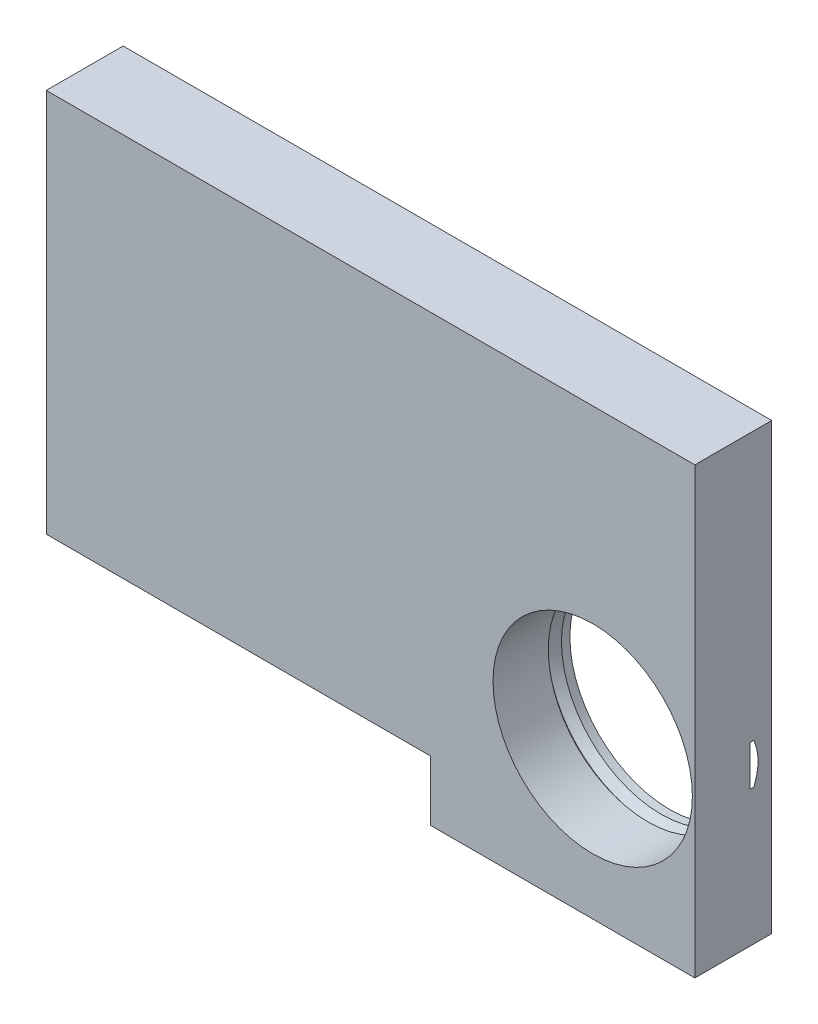
ISO-10303-21;
HEADER;
FILE_DESCRIPTION(('STEP AP214'),'2;1');
FILE_NAME('part.step','',(''),(''),'','','');
FILE_SCHEMA(('AUTOMOTIVE_DESIGN { 1 0 10303 214 1 1 1 1 }'));
ENDSEC;
DATA;
#1=APPLICATION_CONTEXT('core data for automotive mechanical design processes');
#2=APPLICATION_PROTOCOL_DEFINITION('international standard','automotive_design',2000,#1);
#3=PRODUCT_CONTEXT('',#1,'mechanical');
#4=PRODUCT('Part','Part','',(#3));
#5=PRODUCT_RELATED_PRODUCT_CATEGORY('part','',(#4));
#6=PRODUCT_DEFINITION_FORMATION('','',#4);
#7=PRODUCT_DEFINITION_CONTEXT('part definition',#1,'design');
#8=PRODUCT_DEFINITION('design','',#6,#7);
#9=PRODUCT_DEFINITION_SHAPE('','',#8);
#10=(LENGTH_UNIT() NAMED_UNIT(*) SI_UNIT(.MILLI.,.METRE.));
#11=(NAMED_UNIT(*) PLANE_ANGLE_UNIT() SI_UNIT($,.RADIAN.));
#12=(NAMED_UNIT(*) SI_UNIT($,.STERADIAN.) SOLID_ANGLE_UNIT());
#13=UNCERTAINTY_MEASURE_WITH_UNIT(LENGTH_MEASURE(1.E-05),#10,'distance_accuracy_value','');
#14=(GEOMETRIC_REPRESENTATION_CONTEXT(3) GLOBAL_UNCERTAINTY_ASSIGNED_CONTEXT((#13)) GLOBAL_UNIT_ASSIGNED_CONTEXT((#10,
#11,#12)) REPRESENTATION_CONTEXT('',''));
#15=CARTESIAN_POINT('',(0.,0.,0.));
#16=DIRECTION('',(0.,0.,1.));
#17=DIRECTION('',(1.,0.,0.));
#18=AXIS2_PLACEMENT_3D('',#15,#16,#17);
#19=CARTESIAN_POINT('',(4.24621662061371,-52.5,20.7435962404855));
#20=DIRECTION('',(0.,0.,-1.));
#21=DIRECTION('',(-1.,0.,0.));
#22=AXIS2_PLACEMENT_3D('',#19,#20,#21);
#23=CYLINDRICAL_SURFACE('',#22,4.15);
#24=CARTESIAN_POINT('',(4.24621662061371,-52.5,18.4435962404854));
#25=DIRECTION('',(0.,0.,1.));
#26=DIRECTION('',(1.,0.,0.));
#27=AXIS2_PLACEMENT_3D('',#24,#25,#26);
#28=CIRCLE('',#27,4.15);
#29=CARTESIAN_POINT('',(8.3962166206137,-52.5,18.4435962404854));
#30=VERTEX_POINT('',#29);
#31=EDGE_CURVE('E252',#30,#30,#28,.T.);
#32=ORIENTED_EDGE('',*,*,#31,.F.);
#33=EDGE_LOOP('',(#32));
#34=FACE_BOUND('',#33,.T.);
#35=CARTESIAN_POINT('',(4.24621662061371,-52.5,20.7435962404855));
#36=DIRECTION('',(0.,0.,1.));
#37=DIRECTION('',(1.,0.,0.));
#38=AXIS2_PLACEMENT_3D('',#35,#36,#37);
#39=CIRCLE('',#38,4.15);
#40=CARTESIAN_POINT('',(8.3962166206137,-52.5,20.7435962404855));
#41=VERTEX_POINT('',#40);
#42=EDGE_CURVE('E238',#41,#41,#39,.T.);
#43=ORIENTED_EDGE('',*,*,#42,.T.);
#44=EDGE_LOOP('',(#43));
#45=FACE_BOUND('',#44,.T.);
#46=ADVANCED_FACE('F127',(#34,#45),#23,.F.);
#47=CARTESIAN_POINT('',(0.,-40.4999999999999,20.7435962404855));
#48=DIRECTION('',(0.,-1.,0.));
#49=DIRECTION('',(0.,0.,-1.));
#50=AXIS2_PLACEMENT_3D('',#47,#48,#49);
#51=PLANE('',#50);
#52=DIRECTION('',(-1.,0.,0.));
#53=VECTOR('',#52,1.);
#54=CARTESIAN_POINT('',(0.,-40.4999999999999,17.5435962404855));
#55=LINE('',#54,#53);
#56=CARTESIAN_POINT('',(8.49883318564227,-40.4999999999999,17.5435962404855));
#57=VERTEX_POINT('',#56);
#58=CARTESIAN_POINT('',(-18.5011668143577,-40.4999999999999,17.5435962404855));
#59=VERTEX_POINT('',#58);
#60=EDGE_CURVE('E230',#57,#59,#55,.T.);
#61=ORIENTED_EDGE('',*,*,#60,.T.);
#62=DIRECTION('',(0.,0.,-1.));
#63=VECTOR('',#62,1.);
#64=CARTESIAN_POINT('',(-18.5011668143577,-40.4999999999999,20.7435962404855));
#65=LINE('',#64,#63);
#66=CARTESIAN_POINT('',(-18.5011668143577,-40.4999999999999,20.7435962404855));
#67=VERTEX_POINT('',#66);
#68=EDGE_CURVE('E242',#67,#59,#65,.T.);
#69=ORIENTED_EDGE('',*,*,#68,.F.);
#70=DIRECTION('',(-1.,0.,0.));
#71=VECTOR('',#70,1.);
#72=CARTESIAN_POINT('',(0.,-40.4999999999999,20.7435962404855));
#73=LINE('',#72,#71);
#74=CARTESIAN_POINT('',(8.49883318564227,-40.4999999999999,20.7435962404855));
#75=VERTEX_POINT('',#74);
#76=EDGE_CURVE('E186',#75,#67,#73,.T.);
#77=ORIENTED_EDGE('',*,*,#76,.F.);
#78=DIRECTION('',(0.,0.,-1.));
#79=VECTOR('',#78,1.);
#80=CARTESIAN_POINT('',(8.49883318564227,-40.4999999999999,20.7435962404855));
#81=LINE('',#80,#79);
#82=EDGE_CURVE('E245',#75,#57,#81,.T.);
#83=ORIENTED_EDGE('',*,*,#82,.T.);
#84=EDGE_LOOP('',(#61,#69,#77,#83));
#85=FACE_BOUND('',#84,.T.);
#86=ADVANCED_FACE('F314',(#85),#51,.F.);
#87=CARTESIAN_POINT('',(-18.5011668143577,0.,20.7435962404855));
#88=DIRECTION('',(1.,0.,0.));
#89=DIRECTION('',(0.,1.,0.));
#90=AXIS2_PLACEMENT_3D('',#87,#88,#89);
#91=PLANE('',#90);
#92=DIRECTION('',(0.,-1.,0.));
#93=VECTOR('',#92,1.);
#94=CARTESIAN_POINT('',(-18.5011668143577,0.,17.5435962404855));
#95=LINE('',#94,#93);
#96=CARTESIAN_POINT('',(-18.5011668143577,-56.4999999999999,17.5435962404855));
#97=VERTEX_POINT('',#96);
#98=EDGE_CURVE('E232',#59,#97,#95,.T.);
#99=ORIENTED_EDGE('',*,*,#98,.T.);
#100=DIRECTION('',(0.,0.,-1.));
#101=VECTOR('',#100,1.);
#102=CARTESIAN_POINT('',(-18.5011668143577,-56.4999999999999,20.7435962404855));
#103=LINE('',#102,#101);
#104=CARTESIAN_POINT('',(-18.5011668143577,-56.4999999999999,20.7435962404855));
#105=VERTEX_POINT('',#104);
#106=EDGE_CURVE('E214',#105,#97,#103,.T.);
#107=ORIENTED_EDGE('',*,*,#106,.F.);
#108=DIRECTION('',(0.,-1.,0.));
#109=VECTOR('',#108,1.);
#110=CARTESIAN_POINT('',(-18.5011668143577,0.,20.7435962404855));
#111=LINE('',#110,#109);
#112=EDGE_CURVE('E201',#67,#105,#111,.T.);
#113=ORIENTED_EDGE('',*,*,#112,.F.);
#114=ORIENTED_EDGE('',*,*,#68,.T.);
#115=EDGE_LOOP('',(#99,#107,#113,#114));
#116=FACE_BOUND('',#115,.T.);
#117=ADVANCED_FACE('F312',(#116),#91,.F.);
#118=CARTESIAN_POINT('',(0.,-56.4999999999999,20.7435962404855));
#119=DIRECTION('',(0.,1.,0.));
#120=DIRECTION('',(-1.,0.,0.));
#121=AXIS2_PLACEMENT_3D('',#118,#119,#120);
#122=PLANE('',#121);
#123=DIRECTION('',(1.,0.,0.));
#124=VECTOR('',#123,1.);
#125=CARTESIAN_POINT('',(0.,-56.4999999999999,17.5435962404855));
#126=LINE('',#125,#124);
#127=CARTESIAN_POINT('',(-2.50116681435773,-56.4999999999999,17.5435962404855));
#128=VERTEX_POINT('',#127);
#129=EDGE_CURVE('E210',#97,#128,#126,.T.);
#130=ORIENTED_EDGE('',*,*,#129,.T.);
#131=DIRECTION('',(0.,0.,-1.));
#132=VECTOR('',#131,1.);
#133=CARTESIAN_POINT('',(-2.50116681435773,-56.4999999999999,20.7435962404855));
#134=LINE('',#133,#132);
#135=CARTESIAN_POINT('',(-2.50116681435773,-56.4999999999999,20.7435962404855));
#136=VERTEX_POINT('',#135);
#137=EDGE_CURVE('E207',#136,#128,#134,.T.);
#138=ORIENTED_EDGE('',*,*,#137,.F.);
#139=DIRECTION('',(1.,0.,0.));
#140=VECTOR('',#139,1.);
#141=CARTESIAN_POINT('',(0.,-56.4999999999999,20.7435962404855));
#142=LINE('',#141,#140);
#143=EDGE_CURVE('E195',#105,#136,#142,.T.);
#144=ORIENTED_EDGE('',*,*,#143,.F.);
#145=ORIENTED_EDGE('',*,*,#106,.T.);
#146=EDGE_LOOP('',(#130,#138,#144,#145));
#147=FACE_BOUND('',#146,.T.);
#148=ADVANCED_FACE('F208',(#147),#122,.F.);
#149=CARTESIAN_POINT('',(-2.50116681435772,0.,20.7435962404855));
#150=DIRECTION('',(-1.,0.,0.));
#151=DIRECTION('',(0.,-1.,0.));
#152=AXIS2_PLACEMENT_3D('',#149,#150,#151);
#153=PLANE('',#152);
#154=DIRECTION('',(0.,1.,0.));
#155=VECTOR('',#154,1.);
#156=CARTESIAN_POINT('',(-2.50116681435772,0.,17.5435962404855));
#157=LINE('',#156,#155);
#158=CARTESIAN_POINT('',(-2.50116681435773,-59.,17.5435962404855));
#159=VERTEX_POINT('',#158);
#160=EDGE_CURVE('E235',#159,#128,#157,.T.);
#161=ORIENTED_EDGE('',*,*,#160,.F.);
#162=DIRECTION('',(0.,0.,-1.));
#163=VECTOR('',#162,1.);
#164=CARTESIAN_POINT('',(-2.50116681435773,-59.,20.7435962404855));
#165=LINE('',#164,#163);
#166=CARTESIAN_POINT('',(-2.50116681435773,-59.,20.7435962404855));
#167=VERTEX_POINT('',#166);
#168=EDGE_CURVE('E215',#167,#159,#165,.T.);
#169=ORIENTED_EDGE('',*,*,#168,.F.);
#170=DIRECTION('',(0.,1.,0.));
#171=VECTOR('',#170,1.);
#172=CARTESIAN_POINT('',(-2.50116681435772,0.,20.7435962404855));
#173=LINE('',#172,#171);
#174=EDGE_CURVE('E199',#167,#136,#173,.T.);
#175=ORIENTED_EDGE('',*,*,#174,.T.);
#176=ORIENTED_EDGE('',*,*,#137,.T.);
#177=EDGE_LOOP('',(#161,#169,#175,#176));
#178=FACE_BOUND('',#177,.T.);
#179=ADVANCED_FACE('F217',(#178),#153,.T.);
#180=CARTESIAN_POINT('',(0.,-59.,20.7435962404855));
#181=DIRECTION('',(0.,1.,0.));
#182=DIRECTION('',(0.,0.,1.));
#183=AXIS2_PLACEMENT_3D('',#180,#181,#182);
#184=PLANE('',#183);
#185=DIRECTION('',(1.,0.,0.));
#186=VECTOR('',#185,1.);
#187=CARTESIAN_POINT('',(0.,-59.,17.5435962404855));
#188=LINE('',#187,#186);
#189=CARTESIAN_POINT('',(8.49883318564227,-59.,17.5435962404855));
#190=VERTEX_POINT('',#189);
#191=EDGE_CURVE('E177',#159,#190,#188,.T.);
#192=ORIENTED_EDGE('',*,*,#191,.T.);
#193=DIRECTION('',(0.,0.,-1.));
#194=VECTOR('',#193,1.);
#195=CARTESIAN_POINT('',(8.49883318564227,-59.,20.7435962404855));
#196=LINE('',#195,#194);
#197=CARTESIAN_POINT('',(8.49883318564227,-59.,20.7435962404855));
#198=VERTEX_POINT('',#197);
#199=EDGE_CURVE('E219',#198,#190,#196,.T.);
#200=ORIENTED_EDGE('',*,*,#199,.F.);
#201=DIRECTION('',(1.,0.,0.));
#202=VECTOR('',#201,1.);
#203=CARTESIAN_POINT('',(0.,-59.,20.7435962404855));
#204=LINE('',#203,#202);
#205=EDGE_CURVE('E150',#167,#198,#204,.T.);
#206=ORIENTED_EDGE('',*,*,#205,.F.);
#207=ORIENTED_EDGE('',*,*,#168,.T.);
#208=EDGE_LOOP('',(#192,#200,#206,#207));
#209=FACE_BOUND('',#208,.T.);
#210=ADVANCED_FACE('F305',(#209),#184,.F.);
#211=CARTESIAN_POINT('',(8.49883318564227,0.,20.7435962404855));
#212=DIRECTION('',(-1.,0.,0.));
#213=DIRECTION('',(0.,0.,1.));
#214=AXIS2_PLACEMENT_3D('',#211,#212,#213);
#215=PLANE('',#214);
#216=DIRECTION('',(0.,0.,1.));
#217=VECTOR('',#216,1.);
#218=CARTESIAN_POINT('',(8.49883318564227,-53.3411167284295,18.3435962404854));
#219=LINE('',#218,#217);
#220=CARTESIAN_POINT('',(8.49883318564227,-53.3411167284295,18.2903860123746));
#221=VERTEX_POINT('',#220);
#222=CARTESIAN_POINT('',(8.49883318564227,-53.3411167284295,18.4435962404854));
#223=VERTEX_POINT('',#222);
#224=EDGE_CURVE('E12',#221,#223,#219,.T.);
#225=ORIENTED_EDGE('',*,*,#224,.T.);
#226=DIRECTION('',(0.,1.,0.));
#227=VECTOR('',#226,1.);
#228=CARTESIAN_POINT('',(8.49883318564227,0.,18.4435962404854));
#229=LINE('',#228,#227);
#230=CARTESIAN_POINT('',(8.49883318564227,-51.6588832715705,18.4435962404854));
#231=VERTEX_POINT('',#230);
#232=EDGE_CURVE('E227',#223,#231,#229,.T.);
#233=ORIENTED_EDGE('',*,*,#232,.T.);
#234=DIRECTION('',(0.,0.,1.));
#235=VECTOR('',#234,1.);
#236=CARTESIAN_POINT('',(8.49883318564227,-51.6588832715705,18.3435962404854));
#237=LINE('',#236,#235);
#238=CARTESIAN_POINT('',(8.49883318564227,-51.6588832715705,18.2903860123746));
#239=VERTEX_POINT('',#238);
#240=EDGE_CURVE('E135',#231,#239,#237,.F.);
#241=ORIENTED_EDGE('',*,*,#240,.T.);
#242=CARTESIAN_POINT('',(8.49883318564227,-45.2641952592635,26.9926889170407));
#243=CARTESIAN_POINT('',(8.49883318564227,-45.3802025240623,26.7782253549499));
#244=CARTESIAN_POINT('',(8.49883318564227,-45.4967520610303,26.5640535493811));
#245=CARTESIAN_POINT('',(8.49883318564227,-45.7311272786704,26.1364026154542));
#246=CARTESIAN_POINT('',(8.49883318564227,-45.848952991242,25.9229235045849));
#247=CARTESIAN_POINT('',(8.49883318564227,-46.0861583079622,25.4966126408774));
#248=CARTESIAN_POINT('',(8.49883318564227,-46.2055390463143,25.2837815184668));
#249=CARTESIAN_POINT('',(8.49883318564227,-46.4460066357519,24.8590867331002));
#250=CARTESIAN_POINT('',(8.49883318564227,-46.5670934726002,24.6472230620904));
#251=CARTESIAN_POINT('',(8.49883318564227,-46.8133485001215,24.2210611470639));
#252=CARTESIAN_POINT('',(8.49883318564227,-46.9385510796836,24.0067827479244));
#253=CARTESIAN_POINT('',(8.49883318564227,-47.1914268622209,23.5796893879608));
#254=CARTESIAN_POINT('',(8.49883318564227,-47.3191000392008,23.3668744117707));
#255=CARTESIAN_POINT('',(8.49883318564227,-47.5773871437798,22.9431287286092));
#256=CARTESIAN_POINT('',(8.49883318564227,-47.7080000902901,22.7321974248857));
#257=CARTESIAN_POINT('',(8.49883318564227,-47.9728718979863,22.3126415890122));
#258=CARTESIAN_POINT('',(8.49883318564227,-48.1071306121119,22.1040169642933));
#259=CARTESIAN_POINT('',(8.49883318564227,-48.379689619291,21.6905256609704));
#260=CARTESIAN_POINT('',(8.49883318564227,-48.5179730344161,21.4856478962604));
#261=CARTESIAN_POINT('',(8.49883318564227,-48.8003141984705,21.0798049335158));
#262=CARTESIAN_POINT('',(8.49883318564227,-48.944373475431,20.8788407920202));
#263=CARTESIAN_POINT('',(8.49883318564227,-49.2392773019419,20.4833560355072));
#264=CARTESIAN_POINT('',(8.49883318564227,-49.3900876640557,20.2888100741098));
#265=CARTESIAN_POINT('',(8.49883318564227,-49.7014993812316,19.9077661085693));
#266=CARTESIAN_POINT('',(8.49883318564227,-49.8620950840053,19.7212635626852));
#267=CARTESIAN_POINT('',(8.49883318564227,-50.1610655310148,19.3992169998604));
#268=CARTESIAN_POINT('',(8.49883318564227,-50.2968620994453,19.2612958030754));
#269=CARTESIAN_POINT('',(8.49883318564227,-50.5798854442737,18.9964689248859));
#270=CARTESIAN_POINT('',(8.49883318564227,-50.7271453389519,18.8695975869122));
#271=CARTESIAN_POINT('',(8.49883318564227,-50.9598023924089,18.6921583739289));
#272=CARTESIAN_POINT('',(8.49883318564227,-51.0399798369642,18.6347659431637));
#273=CARTESIAN_POINT('',(8.49883318564227,-51.2044339951422,18.5260598789351));
#274=CARTESIAN_POINT('',(8.49883318564227,-51.288711848392,18.4747479491977));
#275=CARTESIAN_POINT('',(8.49883318564227,-51.4611796607351,18.3801766047593));
#276=CARTESIAN_POINT('',(8.49883318564227,-51.5493477969257,18.336877964032));
#277=CARTESIAN_POINT('',(8.49883318564227,-51.7298158703866,18.2601338060797));
#278=CARTESIAN_POINT('',(8.49883318564227,-51.8221111785118,18.2266775536155));
#279=CARTESIAN_POINT('',(8.49883318564227,-52.02825290187,18.1665812358234));
#280=CARTESIAN_POINT('',(8.49883318564227,-52.1428599726705,18.1424471833328));
#281=CARTESIAN_POINT('',(8.49883318564227,-52.3745140300052,18.1143227165537));
#282=CARTESIAN_POINT('',(8.49883318564227,-52.4915591366305,18.1103173197258));
#283=CARTESIAN_POINT('',(8.49883318564227,-52.7244444827695,18.1229921771304));
#284=CARTESIAN_POINT('',(8.49883318564227,-52.8402851538475,18.1396647451646));
#285=CARTESIAN_POINT('',(8.49883318564227,-53.0677194042526,18.191410182301));
#286=CARTESIAN_POINT('',(8.49883318564227,-53.1793088784472,18.2265003761891));
#287=CARTESIAN_POINT('',(8.49883318564227,-53.4561340846147,18.3346342558022));
#288=CARTESIAN_POINT('',(8.49883318564227,-53.6173202537707,18.4179391646002));
#289=CARTESIAN_POINT('',(8.49883318564227,-53.8483843508272,18.5598445999002));
#290=CARTESIAN_POINT('',(8.49883318564227,-53.9237828221042,18.6101080401007));
#291=CARTESIAN_POINT('',(8.49883318564227,-54.0713275394734,18.7152107244298));
#292=CARTESIAN_POINT('',(8.49883318564227,-54.1434746243956,18.7700487778172));
#293=CARTESIAN_POINT('',(8.49883318564227,-54.3191442476167,18.9108788656464));
#294=CARTESIAN_POINT('',(8.49883318564227,-54.4208912986581,18.999068860004));
#295=CARTESIAN_POINT('',(8.49883318564227,-54.6189946857006,19.1813474219124));
#296=CARTESIAN_POINT('',(8.49883318564227,-54.715348020523,19.2754392128068));
#297=CARTESIAN_POINT('',(8.49883318564227,-54.9037063029702,19.4682110863551));
#298=CARTESIAN_POINT('',(8.49883318564227,-54.9957023974252,19.5668997650339));
#299=CARTESIAN_POINT('',(8.49883318564227,-55.1759125023225,19.7676857815203));
#300=CARTESIAN_POINT('',(8.49883318564227,-55.2641258156642,19.8697837414856));
#301=CARTESIAN_POINT('',(8.49883318564227,-55.438210423036,20.077657725538));
#302=CARTESIAN_POINT('',(8.49883318564227,-55.5240502398071,20.1834600111645));
#303=CARTESIAN_POINT('',(8.49883318564227,-55.6929771998,20.3972444633761));
#304=CARTESIAN_POINT('',(8.49883318564227,-55.7760641334976,20.5052267948842));
#305=CARTESIAN_POINT('',(8.49883318564227,-56.0215985394132,20.8315179006278));
#306=CARTESIAN_POINT('',(8.49883318564227,-56.1805529996295,21.0524547268738));
#307=CARTESIAN_POINT('',(8.49883318564227,-56.498172367656,21.5087026736443));
#308=CARTESIAN_POINT('',(8.49883318564227,-56.6565324486426,21.7442238818911));
#309=CARTESIAN_POINT('',(8.49883318564227,-56.96750741589,22.2190484406389));
#310=CARTESIAN_POINT('',(8.49883318564227,-57.1201217368108,22.4583521600389));
#311=CARTESIAN_POINT('',(8.49883318564227,-57.420989011238,22.9399831000231));
#312=CARTESIAN_POINT('',(8.49883318564227,-57.5692377976942,23.182312913817));
#313=CARTESIAN_POINT('',(8.49883318564227,-57.8621404528879,23.6691370478781));
#314=CARTESIAN_POINT('',(8.49883318564227,-58.0067942498239,23.9136314112451));
#315=CARTESIAN_POINT('',(8.49883318564227,-58.2865168274309,24.3929104522677));
#316=CARTESIAN_POINT('',(8.49883318564227,-58.4217184669817,24.6276177477569));
#317=CARTESIAN_POINT('',(8.49883318564227,-58.6899100375772,25.098296002519));
#318=CARTESIAN_POINT('',(8.49883318564227,-58.8228999338363,25.3342669815897));
#319=CARTESIAN_POINT('',(8.49883318564227,-59.0867813080071,25.8068234444734));
#320=CARTESIAN_POINT('',(8.49883318564227,-59.2176761188574,26.0434070696542));
#321=CARTESIAN_POINT('',(8.49883318564227,-59.4778698154782,26.5174380675581));
#322=CARTESIAN_POINT('',(8.49883318564227,-59.6071687664529,26.7548854044748));
#323=CARTESIAN_POINT('',(8.49883318564227,-59.7358047407364,26.9926889170407));
#324=B_SPLINE_CURVE_WITH_KNOTS('',3,(#242,#243,#244,#245,#246,#247,#248,#249,#250,#251,#252,
#253,#254,#255,#256,#257,#258,#259,#260,#261,#262,#263,#264,#265,#266,#267,#268,#269,#270,#271,
#272,#273,#274,#275,#276,#277,#278,#279,#280,#281,#282,#283,#284,#285,#286,#287,#288,#289,#290,
#291,#292,#293,#294,#295,#296,#297,#298,#299,#300,#301,#302,#303,#304,#305,#306,#307,#308,#309,
#310,#311,#312,#313,#314,#315,#316,#317,#318,#319,#320,#321,#322,#323),.UNSPECIFIED.,.F.,.F.,(4,
2,2,2,2,2,2,2,2,2,2,2,2,2,2,2,2,2,2,2,2,2,2,2,2,2,2,2,2,2,2,2,2,2,2,2,2,2,2,2,4),(0.,
0.731486574157134,1.46299147505253,2.1950636691277,2.92712975772856,3.67164158655373,
4.41614558596161,5.16040470204946,5.90463384121021,6.64609661431822,7.38775685618474,
8.12601214755134,8.86384497181479,9.44411806928892,10.02613470984,10.3217300631598,
10.6174080459559,10.9115979793507,11.2054658355113,11.55521621951,11.9047062321277,
12.2540663748742,12.6037557384382,13.1447532382718,13.4165205307725,13.6882173034743,
14.0918401543254,14.4956854016693,14.9003187824903,15.3050264125441,15.7137054907723,
16.1224156027748,16.9387342360596,17.7900649461141,18.6414792030327,19.4936814223864,
20.3459006488567,21.1584769933286,21.9710661056652,22.7821992393988,23.593299121147),.UNSPECIFIED.);
#325=EDGE_CURVE('E250',#239,#221,#324,.T.);
#326=ORIENTED_EDGE('',*,*,#325,.T.);
#327=EDGE_LOOP('',(#225,#233,#241,#326));
#328=FACE_BOUND('',#327,.T.);
#329=DIRECTION('',(0.,1.,0.));
#330=VECTOR('',#329,1.);
#331=CARTESIAN_POINT('',(8.49883318564227,0.,17.5435962404855));
#332=LINE('',#331,#330);
#333=EDGE_CURVE('E226',#190,#57,#332,.T.);
#334=ORIENTED_EDGE('',*,*,#333,.T.);
#335=ORIENTED_EDGE('',*,*,#82,.F.);
#336=DIRECTION('',(0.,1.,0.));
#337=VECTOR('',#336,1.);
#338=CARTESIAN_POINT('',(8.49883318564227,0.,20.7435962404855));
#339=LINE('',#338,#337);
#340=EDGE_CURVE('E326',#198,#75,#339,.T.);
#341=ORIENTED_EDGE('',*,*,#340,.F.);
#342=ORIENTED_EDGE('',*,*,#199,.T.);
#343=EDGE_LOOP('',(#334,#335,#341,#342));
#344=FACE_BOUND('',#343,.T.);
#345=ADVANCED_FACE('F260',(#328,#344),#215,.F.);
#346=CARTESIAN_POINT('',(4.24621662061365,-52.5,17.8936522320844));
#347=DIRECTION('',(0.,0.,1.));
#348=DIRECTION('',(1.,0.,0.));
#349=AXIS2_PLACEMENT_3D('',#346,#347,#348);
#350=CIRCLE('',#349,4.15);
#351=CARTESIAN_POINT('',(8.39621662061364,-52.5,17.8936522320844));
#352=VERTEX_POINT('',#351);
#353=EDGE_CURVE('E247',#352,#352,#350,.F.);
#354=ORIENTED_EDGE('',*,*,#353,.F.);
#355=EDGE_LOOP('',(#354));
#356=FACE_BOUND('',#355,.T.);
#357=CARTESIAN_POINT('',(4.24621662061371,-52.5,17.5435962404855));
#358=DIRECTION('',(0.,0.,1.));
#359=DIRECTION('',(1.,0.,0.));
#360=AXIS2_PLACEMENT_3D('',#357,#358,#359);
#361=CIRCLE('',#360,4.15);
#362=CARTESIAN_POINT('',(8.3962166206137,-52.5,17.5435962404855));
#363=VERTEX_POINT('',#362);
#364=EDGE_CURVE('E223',#363,#363,#361,.T.);
#365=ORIENTED_EDGE('',*,*,#364,.F.);
#366=EDGE_LOOP('',(#365));
#367=FACE_BOUND('',#366,.T.);
#368=ADVANCED_FACE('F129',(#356,#367),#23,.F.);
#369=CARTESIAN_POINT('',(0.,0.,17.5435962404855));
#370=DIRECTION('',(0.,0.,1.));
#371=DIRECTION('',(1.,0.,0.));
#372=AXIS2_PLACEMENT_3D('',#369,#370,#371);
#373=PLANE('',#372);
#374=CARTESIAN_POINT('',(-6.52616681435773,-44.5249999999999,17.5435962404855));
#375=DIRECTION('',(0.,0.,1.));
#376=DIRECTION('',(1.,0.,0.));
#377=AXIS2_PLACEMENT_3D('',#374,#375,#376);
#378=CIRCLE('',#377,2.575);
#379=CARTESIAN_POINT('',(-3.95116681435773,-44.5249999999999,17.5435962404855));
#380=VERTEX_POINT('',#379);
#381=EDGE_CURVE('E519',#380,#380,#378,.T.);
#382=ORIENTED_EDGE('',*,*,#381,.T.);
#383=EDGE_LOOP('',(#382));
#384=FACE_BOUND('',#383,.T.);
#385=CARTESIAN_POINT('',(-6.52616681435773,-52.4749999999999,17.5435962404855));
#386=DIRECTION('',(0.,0.,1.));
#387=DIRECTION('',(1.,0.,0.));
#388=AXIS2_PLACEMENT_3D('',#385,#386,#387);
#389=CIRCLE('',#388,2.575);
#390=CARTESIAN_POINT('',(-3.95116681435773,-52.4749999999999,17.5435962404855));
#391=VERTEX_POINT('',#390);
#392=EDGE_CURVE('E538',#391,#391,#389,.T.);
#393=ORIENTED_EDGE('',*,*,#392,.T.);
#394=EDGE_LOOP('',(#393));
#395=FACE_BOUND('',#394,.T.);
#396=CARTESIAN_POINT('',(-14.4761668143577,-52.4749999999999,17.5435962404855));
#397=DIRECTION('',(0.,0.,1.));
#398=DIRECTION('',(1.,0.,0.));
#399=AXIS2_PLACEMENT_3D('',#396,#397,#398);
#400=CIRCLE('',#399,2.575);
#401=CARTESIAN_POINT('',(-11.9011668143577,-52.4749999999999,17.5435962404855));
#402=VERTEX_POINT('',#401);
#403=EDGE_CURVE('E529',#402,#402,#400,.T.);
#404=ORIENTED_EDGE('',*,*,#403,.T.);
#405=EDGE_LOOP('',(#404));
#406=FACE_BOUND('',#405,.T.);
#407=CARTESIAN_POINT('',(-14.4761668143577,-44.5249999999999,17.5435962404855));
#408=DIRECTION('',(0.,0.,1.));
#409=DIRECTION('',(1.,0.,0.));
#410=AXIS2_PLACEMENT_3D('',#407,#408,#409);
#411=CIRCLE('',#410,2.575);
#412=CARTESIAN_POINT('',(-11.9011668143577,-44.5249999999999,17.5435962404855));
#413=VERTEX_POINT('',#412);
#414=EDGE_CURVE('E527',#413,#413,#411,.T.);
#415=ORIENTED_EDGE('',*,*,#414,.T.);
#416=EDGE_LOOP('',(#415));
#417=FACE_BOUND('',#416,.T.);
#418=ORIENTED_EDGE('',*,*,#364,.T.);
#419=EDGE_LOOP('',(#418));
#420=FACE_BOUND('',#419,.T.);
#421=ORIENTED_EDGE('',*,*,#333,.F.);
#422=ORIENTED_EDGE('',*,*,#191,.F.);
#423=ORIENTED_EDGE('',*,*,#160,.T.);
#424=ORIENTED_EDGE('',*,*,#129,.F.);
#425=ORIENTED_EDGE('',*,*,#98,.F.);
#426=ORIENTED_EDGE('',*,*,#60,.F.);
#427=EDGE_LOOP('',(#421,#422,#423,#424,#425,#426));
#428=FACE_BOUND('',#427,.T.);
#429=ADVANCED_FACE('F300',(#384,#395,#406,#417,#420,#428),#373,.F.);
#430=CARTESIAN_POINT('',(0.,0.,20.7435962404855));
#431=DIRECTION('',(0.,0.,1.));
#432=DIRECTION('',(1.,0.,0.));
#433=AXIS2_PLACEMENT_3D('',#430,#431,#432);
#434=PLANE('',#433);
#435=ORIENTED_EDGE('',*,*,#42,.F.);
#436=EDGE_LOOP('',(#435));
#437=FACE_BOUND('',#436,.T.);
#438=ORIENTED_EDGE('',*,*,#340,.T.);
#439=ORIENTED_EDGE('',*,*,#76,.T.);
#440=ORIENTED_EDGE('',*,*,#112,.T.);
#441=ORIENTED_EDGE('',*,*,#143,.T.);
#442=ORIENTED_EDGE('',*,*,#174,.F.);
#443=ORIENTED_EDGE('',*,*,#205,.T.);
#444=EDGE_LOOP('',(#438,#439,#440,#441,#442,#443));
#445=FACE_BOUND('',#444,.T.);
#446=ADVANCED_FACE('F197',(#437,#445),#434,.T.);
#447=CARTESIAN_POINT('',(4.24621662061365,-52.5,18.3435962404854));
#448=DIRECTION('',(0.,0.,1.));
#449=DIRECTION('',(1.,0.,0.));
#450=AXIS2_PLACEMENT_3D('',#447,#448,#449);
#451=CYLINDRICAL_SURFACE('',#450,4.33499999999998);
#452=CARTESIAN_POINT('',(4.24621662061365,-52.5,18.2903860123746));
#453=DIRECTION('',(0.,0.,1.));
#454=DIRECTION('',(1.,0.,0.));
#455=AXIS2_PLACEMENT_3D('',#452,#453,#454);
#456=CIRCLE('',#455,4.33499999999998);
#457=EDGE_CURVE('E141',#239,#221,#456,.T.);
#458=ORIENTED_EDGE('',*,*,#457,.F.);
#459=ORIENTED_EDGE('',*,*,#240,.F.);
#460=CARTESIAN_POINT('',(4.24621662061365,-52.5,18.4435962404854));
#461=DIRECTION('',(0.,0.,1.));
#462=DIRECTION('',(1.,0.,0.));
#463=AXIS2_PLACEMENT_3D('',#460,#461,#462);
#464=CIRCLE('',#463,4.33499999999998);
#465=EDGE_CURVE('E251',#231,#223,#464,.T.);
#466=ORIENTED_EDGE('',*,*,#465,.T.);
#467=ORIENTED_EDGE('',*,*,#224,.F.);
#468=EDGE_LOOP('',(#458,#459,#466,#467));
#469=FACE_BOUND('',#468,.T.);
#470=ADVANCED_FACE('F268',(#469),#451,.F.);
#471=CARTESIAN_POINT('',(0.346216663454507,-52.5,18.4435962404854));
#472=DIRECTION('',(0.,0.,1.));
#473=DIRECTION('',(1.,0.,0.));
#474=AXIS2_PLACEMENT_3D('',#471,#472,#473);
#475=PLANE('',#474);
#476=ORIENTED_EDGE('',*,*,#31,.T.);
#477=EDGE_LOOP('',(#476));
#478=FACE_BOUND('',#477,.T.);
#479=ORIENTED_EDGE('',*,*,#465,.F.);
#480=ORIENTED_EDGE('',*,*,#232,.F.);
#481=EDGE_LOOP('',(#479,#480));
#482=FACE_BOUND('',#481,.T.);
#483=ADVANCED_FACE('F270',(#478,#482),#475,.F.);
#484=CARTESIAN_POINT('',(4.24621662061365,-52.5,18.2903860123746));
#485=DIRECTION('',(0.,0.,1.));
#486=DIRECTION('',(1.,0.,0.));
#487=AXIS2_PLACEMENT_3D('',#484,#485,#486);
#488=CONICAL_SURFACE('',#487,4.33499999999998,0.436332313002477);
#489=ORIENTED_EDGE('',*,*,#353,.T.);
#490=EDGE_LOOP('',(#489));
#491=FACE_BOUND('',#490,.T.);
#492=ORIENTED_EDGE('',*,*,#457,.T.);
#493=ORIENTED_EDGE('',*,*,#325,.F.);
#494=EDGE_LOOP('',(#492,#493));
#495=FACE_BOUND('',#494,.T.);
#496=ADVANCED_FACE('F285',(#491,#495),#488,.F.);
#497=CARTESIAN_POINT('',(-14.4761668143577,-44.5249999999999,19.3435962404855));
#498=DIRECTION('',(0.,0.,-1.));
#499=DIRECTION('',(-1.,0.,0.));
#500=AXIS2_PLACEMENT_3D('',#497,#498,#499);
#501=CYLINDRICAL_SURFACE('',#500,2.575);
#502=CARTESIAN_POINT('',(-14.4761668143577,-44.5249999999999,19.3435962404855));
#503=DIRECTION('',(0.,0.,1.));
#504=DIRECTION('',(1.,0.,0.));
#505=AXIS2_PLACEMENT_3D('',#502,#503,#504);
#506=CIRCLE('',#505,2.575);
#507=CARTESIAN_POINT('',(-11.9011668143577,-44.5249999999999,19.3435962404855));
#508=VERTEX_POINT('',#507);
#509=EDGE_CURVE('E272',#508,#508,#506,.T.);
#510=ORIENTED_EDGE('',*,*,#509,.T.);
#511=EDGE_LOOP('',(#510));
#512=FACE_BOUND('',#511,.T.);
#513=ORIENTED_EDGE('',*,*,#414,.F.);
#514=EDGE_LOOP('',(#513));
#515=FACE_BOUND('',#514,.T.);
#516=ADVANCED_FACE('F290',(#512,#515),#501,.F.);
#517=CARTESIAN_POINT('',(-14.4761668143577,-44.5249999999999,19.3435962404855));
#518=DIRECTION('',(0.,0.,1.));
#519=DIRECTION('',(1.,0.,0.));
#520=AXIS2_PLACEMENT_3D('',#517,#518,#519);
#521=PLANE('',#520);
#522=ORIENTED_EDGE('',*,*,#509,.F.);
#523=EDGE_LOOP('',(#522));
#524=FACE_BOUND('',#523,.T.);
#525=ADVANCED_FACE('F372',(#524),#521,.F.);
#526=CARTESIAN_POINT('',(-14.4761668143577,-52.4749999999999,19.3435962404855));
#527=DIRECTION('',(0.,0.,-1.));
#528=DIRECTION('',(-1.,0.,0.));
#529=AXIS2_PLACEMENT_3D('',#526,#527,#528);
#530=CYLINDRICAL_SURFACE('',#529,2.575);
#531=CARTESIAN_POINT('',(-14.4761668143577,-52.4749999999999,19.3435962404855));
#532=DIRECTION('',(0.,0.,1.));
#533=DIRECTION('',(1.,0.,0.));
#534=AXIS2_PLACEMENT_3D('',#531,#532,#533);
#535=CIRCLE('',#534,2.575);
#536=CARTESIAN_POINT('',(-11.9011668143577,-52.4749999999999,19.3435962404855));
#537=VERTEX_POINT('',#536);
#538=EDGE_CURVE('E533',#537,#537,#535,.T.);
#539=ORIENTED_EDGE('',*,*,#538,.T.);
#540=EDGE_LOOP('',(#539));
#541=FACE_BOUND('',#540,.T.);
#542=ORIENTED_EDGE('',*,*,#403,.F.);
#543=EDGE_LOOP('',(#542));
#544=FACE_BOUND('',#543,.T.);
#545=ADVANCED_FACE('F380',(#541,#544),#530,.F.);
#546=CARTESIAN_POINT('',(-14.4761668143577,-52.4749999999999,19.3435962404855));
#547=DIRECTION('',(0.,0.,1.));
#548=DIRECTION('',(1.,0.,0.));
#549=AXIS2_PLACEMENT_3D('',#546,#547,#548);
#550=PLANE('',#549);
#551=ORIENTED_EDGE('',*,*,#538,.F.);
#552=EDGE_LOOP('',(#551));
#553=FACE_BOUND('',#552,.T.);
#554=ADVANCED_FACE('F388',(#553),#550,.F.);
#555=CARTESIAN_POINT('',(-6.52616681435773,-52.4749999999999,19.3435962404855));
#556=DIRECTION('',(0.,0.,-1.));
#557=DIRECTION('',(-1.,0.,0.));
#558=AXIS2_PLACEMENT_3D('',#555,#556,#557);
#559=CYLINDRICAL_SURFACE('',#558,2.575);
#560=CARTESIAN_POINT('',(-6.52616681435773,-52.4749999999999,19.3435962404855));
#561=DIRECTION('',(0.,0.,1.));
#562=DIRECTION('',(1.,0.,0.));
#563=AXIS2_PLACEMENT_3D('',#560,#561,#562);
#564=CIRCLE('',#563,2.575);
#565=CARTESIAN_POINT('',(-3.95116681435773,-52.4749999999999,19.3435962404855));
#566=VERTEX_POINT('',#565);
#567=EDGE_CURVE('E522',#566,#566,#564,.T.);
#568=ORIENTED_EDGE('',*,*,#567,.T.);
#569=EDGE_LOOP('',(#568));
#570=FACE_BOUND('',#569,.T.);
#571=ORIENTED_EDGE('',*,*,#392,.F.);
#572=EDGE_LOOP('',(#571));
#573=FACE_BOUND('',#572,.T.);
#574=ADVANCED_FACE('F397',(#570,#573),#559,.F.);
#575=CARTESIAN_POINT('',(-6.52616681435773,-52.4749999999999,19.3435962404855));
#576=DIRECTION('',(0.,0.,1.));
#577=DIRECTION('',(1.,0.,0.));
#578=AXIS2_PLACEMENT_3D('',#575,#576,#577);
#579=PLANE('',#578);
#580=ORIENTED_EDGE('',*,*,#567,.F.);
#581=EDGE_LOOP('',(#580));
#582=FACE_BOUND('',#581,.T.);
#583=ADVANCED_FACE('F406',(#582),#579,.F.);
#584=CARTESIAN_POINT('',(-6.52616681435773,-44.5249999999999,19.3435962404855));
#585=DIRECTION('',(0.,0.,-1.));
#586=DIRECTION('',(-1.,0.,0.));
#587=AXIS2_PLACEMENT_3D('',#584,#585,#586);
#588=CYLINDRICAL_SURFACE('',#587,2.575);
#589=CARTESIAN_POINT('',(-6.52616681435773,-44.5249999999999,19.3435962404855));
#590=DIRECTION('',(0.,0.,1.));
#591=DIRECTION('',(1.,0.,0.));
#592=AXIS2_PLACEMENT_3D('',#589,#590,#591);
#593=CIRCLE('',#592,2.575);
#594=CARTESIAN_POINT('',(-3.95116681435773,-44.5249999999999,19.3435962404855));
#595=VERTEX_POINT('',#594);
#596=EDGE_CURVE('E518',#595,#595,#593,.T.);
#597=ORIENTED_EDGE('',*,*,#596,.T.);
#598=EDGE_LOOP('',(#597));
#599=FACE_BOUND('',#598,.T.);
#600=ORIENTED_EDGE('',*,*,#381,.F.);
#601=EDGE_LOOP('',(#600));
#602=FACE_BOUND('',#601,.T.);
#603=ADVANCED_FACE('F415',(#599,#602),#588,.F.);
#604=CARTESIAN_POINT('',(-6.52616681435773,-44.5249999999999,19.3435962404855));
#605=DIRECTION('',(0.,0.,1.));
#606=DIRECTION('',(1.,0.,0.));
#607=AXIS2_PLACEMENT_3D('',#604,#605,#606);
#608=PLANE('',#607);
#609=ORIENTED_EDGE('',*,*,#596,.F.);
#610=EDGE_LOOP('',(#609));
#611=FACE_BOUND('',#610,.T.);
#612=ADVANCED_FACE('F424',(#611),#608,.F.);
#613=CLOSED_SHELL('',(#46,#86,#117,#148,#179,#210,#345,#368,#429,#446,#470,#483,#496,#516,#525,
#545,#554,#574,#583,#603,#612));
#614=MANIFOLD_SOLID_BREP('B2',#613);
#615=ADVANCED_BREP_SHAPE_REPRESENTATION('',(#18,#614),#14);
#616=SHAPE_DEFINITION_REPRESENTATION(#9,#615);
ENDSEC;
END-ISO-10303-21;
